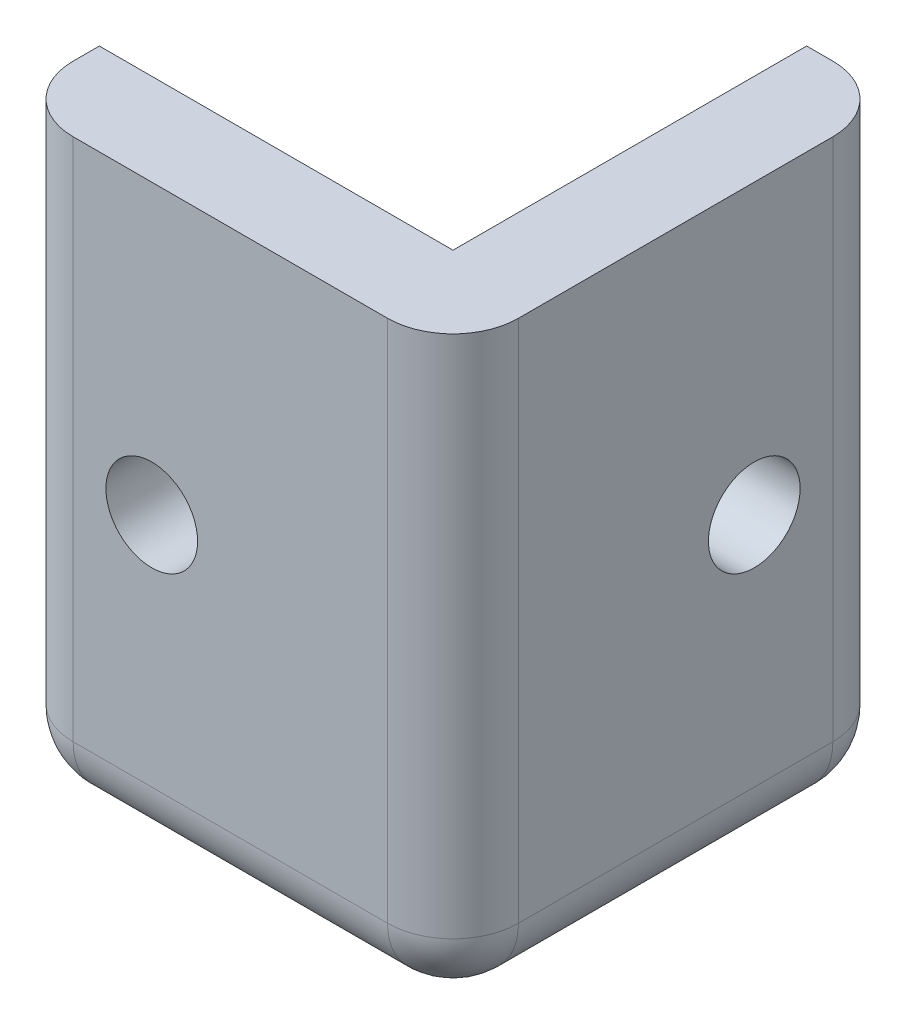
ISO-10303-21;
HEADER;
FILE_DESCRIPTION(('STEP AP214'),'2;1');
FILE_NAME('part.step','',(''),(''),'','','');
FILE_SCHEMA(('AUTOMOTIVE_DESIGN { 1 0 10303 214 1 1 1 1 }'));
ENDSEC;
DATA;
#1=APPLICATION_CONTEXT('core data for automotive mechanical design processes');
#2=APPLICATION_PROTOCOL_DEFINITION('international standard','automotive_design',2000,#1);
#3=PRODUCT_CONTEXT('',#1,'mechanical');
#4=PRODUCT('Part','Part','',(#3));
#5=PRODUCT_RELATED_PRODUCT_CATEGORY('part','',(#4));
#6=PRODUCT_DEFINITION_FORMATION('','',#4);
#7=PRODUCT_DEFINITION_CONTEXT('part definition',#1,'design');
#8=PRODUCT_DEFINITION('design','',#6,#7);
#9=PRODUCT_DEFINITION_SHAPE('','',#8);
#10=(LENGTH_UNIT() NAMED_UNIT(*) SI_UNIT(.MILLI.,.METRE.));
#11=(NAMED_UNIT(*) PLANE_ANGLE_UNIT() SI_UNIT($,.RADIAN.));
#12=(NAMED_UNIT(*) SI_UNIT($,.STERADIAN.) SOLID_ANGLE_UNIT());
#13=UNCERTAINTY_MEASURE_WITH_UNIT(LENGTH_MEASURE(1.E-05),#10,'distance_accuracy_value','');
#14=(GEOMETRIC_REPRESENTATION_CONTEXT(3) GLOBAL_UNCERTAINTY_ASSIGNED_CONTEXT((#13)) GLOBAL_UNIT_ASSIGNED_CONTEXT((#10,
#11,#12)) REPRESENTATION_CONTEXT('',''));
#15=CARTESIAN_POINT('',(0.,0.,0.));
#16=DIRECTION('',(0.,0.,1.));
#17=DIRECTION('',(1.,0.,0.));
#18=AXIS2_PLACEMENT_3D('',#15,#16,#17);
#19=CARTESIAN_POINT('',(0.,28.,0.));
#20=DIRECTION('',(1.,0.,0.));
#21=DIRECTION('',(0.,0.,-1.));
#22=AXIS2_PLACEMENT_3D('',#19,#20,#21);
#23=PLANE('',#22);
#24=DIRECTION('',(0.,1.,0.));
#25=VECTOR('',#24,1.);
#26=CARTESIAN_POINT('',(0.,-7.,-27.));
#27=LINE('',#26,#25);
#28=CARTESIAN_POINT('',(0.,-2.,-27.));
#29=VERTEX_POINT('',#28);
#30=CARTESIAN_POINT('',(0.,0.,-27.));
#31=VERTEX_POINT('',#30);
#32=EDGE_CURVE('E204',#29,#31,#27,.T.);
#33=ORIENTED_EDGE('',*,*,#32,.F.);
#34=DIRECTION('',(0.,0.,-1.));
#35=VECTOR('',#34,1.);
#36=CARTESIAN_POINT('',(0.,-2.,0.));
#37=LINE('',#36,#35);
#38=CARTESIAN_POINT('',(0.,-2.,2.));
#39=VERTEX_POINT('',#38);
#40=EDGE_CURVE('E11',#29,#39,#37,.F.);
#41=ORIENTED_EDGE('',*,*,#40,.T.);
#42=DIRECTION('',(0.,-1.,0.));
#43=VECTOR('',#42,1.);
#44=CARTESIAN_POINT('',(0.,28.,2.));
#45=LINE('',#44,#43);
#46=CARTESIAN_POINT('',(0.,38.,2.));
#47=VERTEX_POINT('',#46);
#48=EDGE_CURVE('E235',#39,#47,#45,.F.);
#49=ORIENTED_EDGE('',*,*,#48,.T.);
#50=DIRECTION('',(0.,0.,1.));
#51=VECTOR('',#50,1.);
#52=CARTESIAN_POINT('',(0.,38.,0.));
#53=LINE('',#52,#51);
#54=CARTESIAN_POINT('',(0.,38.,0.));
#55=VERTEX_POINT('',#54);
#56=EDGE_CURVE('E170',#55,#47,#53,.T.);
#57=ORIENTED_EDGE('',*,*,#56,.F.);
#58=DIRECTION('',(0.,-1.,0.));
#59=VECTOR('',#58,1.);
#60=CARTESIAN_POINT('',(0.,28.,0.));
#61=LINE('',#60,#59);
#62=CARTESIAN_POINT('',(0.,0.,0.));
#63=VERTEX_POINT('',#62);
#64=EDGE_CURVE('E212',#55,#63,#61,.T.);
#65=ORIENTED_EDGE('',*,*,#64,.T.);
#66=DIRECTION('',(0.,0.,-1.));
#67=VECTOR('',#66,1.);
#68=CARTESIAN_POINT('',(0.,0.,7.));
#69=LINE('',#68,#67);
#70=EDGE_CURVE('E198',#63,#31,#69,.T.);
#71=ORIENTED_EDGE('',*,*,#70,.T.);
#72=EDGE_LOOP('',(#33,#41,#49,#57,#65,#71));
#73=FACE_BOUND('',#72,.T.);
#74=ADVANCED_FACE('F37',(#73),#23,.F.);
#75=CARTESIAN_POINT('',(0.,28.,7.));
#76=DIRECTION('',(0.,0.,-1.));
#77=DIRECTION('',(-1.,0.,0.));
#78=AXIS2_PLACEMENT_3D('',#75,#76,#77);
#79=PLANE('',#78);
#80=CARTESIAN_POINT('',(11.,16.,7.));
#81=DIRECTION('',(0.,0.,1.));
#82=DIRECTION('',(1.,0.,0.));
#83=AXIS2_PLACEMENT_3D('',#80,#81,#82);
#84=CIRCLE('',#83,3.5);
#85=CARTESIAN_POINT('',(14.5,16.,7.));
#86=VERTEX_POINT('',#85);
#87=EDGE_CURVE('E185',#86,#86,#84,.T.);
#88=ORIENTED_EDGE('',*,*,#87,.F.);
#89=EDGE_LOOP('',(#88));
#90=FACE_BOUND('',#89,.T.);
#91=DIRECTION('',(0.,-1.,0.));
#92=VECTOR('',#91,1.);
#93=CARTESIAN_POINT('',(29.,28.,7.));
#94=LINE('',#93,#92);
#95=CARTESIAN_POINT('',(29.,-2.,7.));
#96=VERTEX_POINT('',#95);
#97=CARTESIAN_POINT('',(29.,38.,7.));
#98=VERTEX_POINT('',#97);
#99=EDGE_CURVE('E225',#96,#98,#94,.F.);
#100=ORIENTED_EDGE('',*,*,#99,.T.);
#101=DIRECTION('',(1.,0.,0.));
#102=VECTOR('',#101,1.);
#103=CARTESIAN_POINT('',(5.,38.,7.));
#104=LINE('',#103,#102);
#105=CARTESIAN_POINT('',(5.,38.,7.));
#106=VERTEX_POINT('',#105);
#107=EDGE_CURVE('E157',#106,#98,#104,.T.);
#108=ORIENTED_EDGE('',*,*,#107,.F.);
#109=DIRECTION('',(0.,-1.,0.));
#110=VECTOR('',#109,1.);
#111=CARTESIAN_POINT('',(5.,28.,7.));
#112=LINE('',#111,#110);
#113=CARTESIAN_POINT('',(5.,-2.,7.));
#114=VERTEX_POINT('',#113);
#115=EDGE_CURVE('E141',#106,#114,#112,.T.);
#116=ORIENTED_EDGE('',*,*,#115,.T.);
#117=DIRECTION('',(-1.,0.,0.));
#118=VECTOR('',#117,1.);
#119=CARTESIAN_POINT('',(0.,-2.,7.));
#120=LINE('',#119,#118);
#121=EDGE_CURVE('E227',#114,#96,#120,.F.);
#122=ORIENTED_EDGE('',*,*,#121,.T.);
#123=EDGE_LOOP('',(#100,#108,#116,#122));
#124=FACE_BOUND('',#123,.T.);
#125=ADVANCED_FACE('F278',(#90,#124),#79,.F.);
#126=CARTESIAN_POINT('',(34.,28.,7.));
#127=DIRECTION('',(-1.,0.,0.));
#128=DIRECTION('',(0.,0.,1.));
#129=AXIS2_PLACEMENT_3D('',#126,#127,#128);
#130=PLANE('',#129);
#131=CARTESIAN_POINT('',(34.,16.,-16.));
#132=DIRECTION('',(1.,0.,0.));
#133=DIRECTION('',(0.,0.,-1.));
#134=AXIS2_PLACEMENT_3D('',#131,#132,#133);
#135=CIRCLE('',#134,3.5);
#136=CARTESIAN_POINT('',(34.,16.,-19.5));
#137=VERTEX_POINT('',#136);
#138=EDGE_CURVE('E195',#137,#137,#135,.T.);
#139=ORIENTED_EDGE('',*,*,#138,.F.);
#140=EDGE_LOOP('',(#139));
#141=FACE_BOUND('',#140,.T.);
#142=DIRECTION('',(0.,0.,1.));
#143=VECTOR('',#142,1.);
#144=CARTESIAN_POINT('',(34.,-2.,7.));
#145=LINE('',#144,#143);
#146=CARTESIAN_POINT('',(34.,-2.,2.));
#147=VERTEX_POINT('',#146);
#148=CARTESIAN_POINT('',(34.,-2.,-22.));
#149=VERTEX_POINT('',#148);
#150=EDGE_CURVE('E140',#147,#149,#145,.F.);
#151=ORIENTED_EDGE('',*,*,#150,.T.);
#152=DIRECTION('',(0.,-1.,0.));
#153=VECTOR('',#152,1.);
#154=CARTESIAN_POINT('',(34.,28.,-22.));
#155=LINE('',#154,#153);
#156=CARTESIAN_POINT('',(34.,38.,-22.));
#157=VERTEX_POINT('',#156);
#158=EDGE_CURVE('E147',#149,#157,#155,.F.);
#159=ORIENTED_EDGE('',*,*,#158,.T.);
#160=DIRECTION('',(0.,0.,-1.));
#161=VECTOR('',#160,1.);
#162=CARTESIAN_POINT('',(34.,38.,2.));
#163=LINE('',#162,#161);
#164=CARTESIAN_POINT('',(34.,38.,2.));
#165=VERTEX_POINT('',#164);
#166=EDGE_CURVE('E144',#165,#157,#163,.T.);
#167=ORIENTED_EDGE('',*,*,#166,.F.);
#168=DIRECTION('',(0.,-1.,0.));
#169=VECTOR('',#168,1.);
#170=CARTESIAN_POINT('',(34.,28.,2.));
#171=LINE('',#170,#169);
#172=EDGE_CURVE('E128',#165,#147,#171,.T.);
#173=ORIENTED_EDGE('',*,*,#172,.T.);
#174=EDGE_LOOP('',(#151,#159,#167,#173));
#175=FACE_BOUND('',#174,.T.);
#176=ADVANCED_FACE('F145',(#141,#175),#130,.F.);
#177=CARTESIAN_POINT('',(27.,28.,-27.));
#178=DIRECTION('',(0.,0.,1.));
#179=DIRECTION('',(1.,0.,0.));
#180=AXIS2_PLACEMENT_3D('',#177,#178,#179);
#181=PLANE('',#180);
#182=DIRECTION('',(0.,-1.,0.));
#183=VECTOR('',#182,1.);
#184=CARTESIAN_POINT('',(29.,28.,-27.));
#185=LINE('',#184,#183);
#186=CARTESIAN_POINT('',(29.,38.,-27.));
#187=VERTEX_POINT('',#186);
#188=CARTESIAN_POINT('',(29.,-2.,-27.));
#189=VERTEX_POINT('',#188);
#190=EDGE_CURVE('E233',#187,#189,#185,.T.);
#191=ORIENTED_EDGE('',*,*,#190,.T.);
#192=DIRECTION('',(1.,0.,0.));
#193=VECTOR('',#192,1.);
#194=CARTESIAN_POINT('',(27.,-2.,-27.));
#195=LINE('',#194,#193);
#196=EDGE_CURVE('E46',#189,#29,#195,.F.);
#197=ORIENTED_EDGE('',*,*,#196,.T.);
#198=ORIENTED_EDGE('',*,*,#32,.T.);
#199=DIRECTION('',(1.,0.,0.));
#200=VECTOR('',#199,1.);
#201=CARTESIAN_POINT('',(34.,0.,-27.));
#202=LINE('',#201,#200);
#203=CARTESIAN_POINT('',(27.,0.,-27.));
#204=VERTEX_POINT('',#203);
#205=EDGE_CURVE('E201',#31,#204,#202,.T.);
#206=ORIENTED_EDGE('',*,*,#205,.T.);
#207=DIRECTION('',(0.,-1.,0.));
#208=VECTOR('',#207,1.);
#209=CARTESIAN_POINT('',(27.,28.,-27.));
#210=LINE('',#209,#208);
#211=CARTESIAN_POINT('',(27.,38.,-27.));
#212=VERTEX_POINT('',#211);
#213=EDGE_CURVE('E218',#212,#204,#210,.T.);
#214=ORIENTED_EDGE('',*,*,#213,.F.);
#215=DIRECTION('',(-1.,0.,0.));
#216=VECTOR('',#215,1.);
#217=CARTESIAN_POINT('',(29.,38.,-27.));
#218=LINE('',#217,#216);
#219=EDGE_CURVE('E161',#187,#212,#218,.T.);
#220=ORIENTED_EDGE('',*,*,#219,.F.);
#221=EDGE_LOOP('',(#191,#197,#198,#206,#214,#220));
#222=FACE_BOUND('',#221,.T.);
#223=ADVANCED_FACE('F295',(#222),#181,.F.);
#224=CARTESIAN_POINT('',(27.,28.,0.));
#225=DIRECTION('',(1.,0.,0.));
#226=DIRECTION('',(0.,0.,-1.));
#227=AXIS2_PLACEMENT_3D('',#224,#225,#226);
#228=PLANE('',#227);
#229=CARTESIAN_POINT('',(27.,16.,-16.));
#230=DIRECTION('',(1.,0.,0.));
#231=DIRECTION('',(0.,0.,-1.));
#232=AXIS2_PLACEMENT_3D('',#229,#230,#231);
#233=CIRCLE('',#232,2.);
#234=CARTESIAN_POINT('',(27.,16.,-18.));
#235=VERTEX_POINT('',#234);
#236=EDGE_CURVE('E190',#235,#235,#233,.T.);
#237=ORIENTED_EDGE('',*,*,#236,.T.);
#238=EDGE_LOOP('',(#237));
#239=FACE_BOUND('',#238,.T.);
#240=DIRECTION('',(0.,0.,1.));
#241=VECTOR('',#240,1.);
#242=CARTESIAN_POINT('',(27.,0.,0.));
#243=LINE('',#242,#241);
#244=CARTESIAN_POINT('',(27.,0.,0.));
#245=VERTEX_POINT('',#244);
#246=EDGE_CURVE('E206',#204,#245,#243,.T.);
#247=ORIENTED_EDGE('',*,*,#246,.T.);
#248=DIRECTION('',(0.,-1.,0.));
#249=VECTOR('',#248,1.);
#250=CARTESIAN_POINT('',(27.,28.,0.));
#251=LINE('',#250,#249);
#252=CARTESIAN_POINT('',(27.,38.,0.));
#253=VERTEX_POINT('',#252);
#254=EDGE_CURVE('E215',#253,#245,#251,.T.);
#255=ORIENTED_EDGE('',*,*,#254,.F.);
#256=DIRECTION('',(0.,0.,1.));
#257=VECTOR('',#256,1.);
#258=CARTESIAN_POINT('',(27.,38.,-27.));
#259=LINE('',#258,#257);
#260=EDGE_CURVE('E164',#212,#253,#259,.T.);
#261=ORIENTED_EDGE('',*,*,#260,.F.);
#262=ORIENTED_EDGE('',*,*,#213,.T.);
#263=EDGE_LOOP('',(#247,#255,#261,#262));
#264=FACE_BOUND('',#263,.T.);
#265=ADVANCED_FACE('F298',(#239,#264),#228,.F.);
#266=CARTESIAN_POINT('',(0.,28.,0.));
#267=DIRECTION('',(0.,0.,1.));
#268=DIRECTION('',(1.,0.,0.));
#269=AXIS2_PLACEMENT_3D('',#266,#267,#268);
#270=PLANE('',#269);
#271=CARTESIAN_POINT('',(11.,16.,0.));
#272=DIRECTION('',(0.,0.,1.));
#273=DIRECTION('',(1.,0.,0.));
#274=AXIS2_PLACEMENT_3D('',#271,#272,#273);
#275=CIRCLE('',#274,2.);
#276=CARTESIAN_POINT('',(13.,16.,0.));
#277=VERTEX_POINT('',#276);
#278=EDGE_CURVE('E180',#277,#277,#275,.T.);
#279=ORIENTED_EDGE('',*,*,#278,.T.);
#280=EDGE_LOOP('',(#279));
#281=FACE_BOUND('',#280,.T.);
#282=DIRECTION('',(-1.,0.,0.));
#283=VECTOR('',#282,1.);
#284=CARTESIAN_POINT('',(0.,0.,0.));
#285=LINE('',#284,#283);
#286=EDGE_CURVE('E209',#245,#63,#285,.T.);
#287=ORIENTED_EDGE('',*,*,#286,.T.);
#288=ORIENTED_EDGE('',*,*,#64,.F.);
#289=DIRECTION('',(-1.,0.,0.));
#290=VECTOR('',#289,1.);
#291=CARTESIAN_POINT('',(27.,38.,0.));
#292=LINE('',#291,#290);
#293=EDGE_CURVE('E167',#253,#55,#292,.T.);
#294=ORIENTED_EDGE('',*,*,#293,.F.);
#295=ORIENTED_EDGE('',*,*,#254,.T.);
#296=EDGE_LOOP('',(#287,#288,#294,#295));
#297=FACE_BOUND('',#296,.T.);
#298=ADVANCED_FACE('F302',(#281,#297),#270,.F.);
#299=CARTESIAN_POINT('',(0.,0.,0.));
#300=DIRECTION('',(0.,1.,0.));
#301=DIRECTION('',(0.,0.,1.));
#302=AXIS2_PLACEMENT_3D('',#299,#300,#301);
#303=PLANE('',#302);
#304=ORIENTED_EDGE('',*,*,#286,.F.);
#305=ORIENTED_EDGE('',*,*,#246,.F.);
#306=ORIENTED_EDGE('',*,*,#205,.F.);
#307=ORIENTED_EDGE('',*,*,#70,.F.);
#308=EDGE_LOOP('',(#304,#305,#306,#307));
#309=FACE_BOUND('',#308,.T.);
#310=ADVANCED_FACE('F305',(#309),#303,.T.);
#311=CARTESIAN_POINT('',(0.,-7.,0.));
#312=DIRECTION('',(0.,1.,0.));
#313=DIRECTION('',(0.,0.,1.));
#314=AXIS2_PLACEMENT_3D('',#311,#312,#313);
#315=PLANE('',#314);
#316=DIRECTION('',(0.,0.,-1.));
#317=VECTOR('',#316,1.);
#318=CARTESIAN_POINT('',(5.,-7.,0.));
#319=LINE('',#318,#317);
#320=CARTESIAN_POINT('',(5.,-7.,2.));
#321=VERTEX_POINT('',#320);
#322=CARTESIAN_POINT('',(5.,-7.,-22.));
#323=VERTEX_POINT('',#322);
#324=EDGE_CURVE('E61',#321,#323,#319,.T.);
#325=ORIENTED_EDGE('',*,*,#324,.T.);
#326=DIRECTION('',(1.,0.,0.));
#327=VECTOR('',#326,1.);
#328=CARTESIAN_POINT('',(0.,-7.,-22.));
#329=LINE('',#328,#327);
#330=CARTESIAN_POINT('',(29.,-7.,-22.));
#331=VERTEX_POINT('',#330);
#332=EDGE_CURVE('E256',#323,#331,#329,.T.);
#333=ORIENTED_EDGE('',*,*,#332,.T.);
#334=DIRECTION('',(0.,0.,1.));
#335=VECTOR('',#334,1.);
#336=CARTESIAN_POINT('',(29.,-7.,0.));
#337=LINE('',#336,#335);
#338=CARTESIAN_POINT('',(29.,-7.,2.));
#339=VERTEX_POINT('',#338);
#340=EDGE_CURVE('E221',#331,#339,#337,.T.);
#341=ORIENTED_EDGE('',*,*,#340,.T.);
#342=DIRECTION('',(-1.,0.,0.));
#343=VECTOR('',#342,1.);
#344=CARTESIAN_POINT('',(0.,-7.,2.));
#345=LINE('',#344,#343);
#346=EDGE_CURVE('E223',#339,#321,#345,.T.);
#347=ORIENTED_EDGE('',*,*,#346,.T.);
#348=EDGE_LOOP('',(#325,#333,#341,#347));
#349=FACE_BOUND('',#348,.T.);
#350=ADVANCED_FACE('F307',(#349),#315,.F.);
#351=CARTESIAN_POINT('',(29.,28.,-22.));
#352=DIRECTION('',(0.,-1.,0.));
#353=DIRECTION('',(0.,0.,-1.));
#354=AXIS2_PLACEMENT_3D('',#351,#352,#353);
#355=CYLINDRICAL_SURFACE('',#354,5.);
#356=ORIENTED_EDGE('',*,*,#158,.F.);
#357=CARTESIAN_POINT('',(29.,-2.,-22.));
#358=DIRECTION('',(0.,-1.,0.));
#359=DIRECTION('',(0.,0.,-1.));
#360=AXIS2_PLACEMENT_3D('',#357,#358,#359);
#361=CIRCLE('',#360,5.);
#362=EDGE_CURVE('E249',#149,#189,#361,.F.);
#363=ORIENTED_EDGE('',*,*,#362,.T.);
#364=ORIENTED_EDGE('',*,*,#190,.F.);
#365=CARTESIAN_POINT('',(29.,38.,-22.));
#366=DIRECTION('',(0.,1.,0.));
#367=DIRECTION('',(0.,0.,1.));
#368=AXIS2_PLACEMENT_3D('',#365,#366,#367);
#369=CIRCLE('',#368,5.);
#370=EDGE_CURVE('E151',#157,#187,#369,.T.);
#371=ORIENTED_EDGE('',*,*,#370,.F.);
#372=EDGE_LOOP('',(#356,#363,#364,#371));
#373=FACE_BOUND('',#372,.T.);
#374=ADVANCED_FACE('F292',(#373),#355,.T.);
#375=CARTESIAN_POINT('',(29.,28.,2.));
#376=DIRECTION('',(0.,-1.,0.));
#377=DIRECTION('',(0.,0.,-1.));
#378=AXIS2_PLACEMENT_3D('',#375,#376,#377);
#379=CYLINDRICAL_SURFACE('',#378,5.);
#380=ORIENTED_EDGE('',*,*,#172,.F.);
#381=CARTESIAN_POINT('',(29.,38.,2.));
#382=DIRECTION('',(0.,1.,0.));
#383=DIRECTION('',(0.,0.,1.));
#384=AXIS2_PLACEMENT_3D('',#381,#382,#383);
#385=CIRCLE('',#384,5.);
#386=EDGE_CURVE('E133',#98,#165,#385,.T.);
#387=ORIENTED_EDGE('',*,*,#386,.F.);
#388=ORIENTED_EDGE('',*,*,#99,.F.);
#389=CARTESIAN_POINT('',(29.,-2.,2.));
#390=DIRECTION('',(0.,-1.,0.));
#391=DIRECTION('',(0.,0.,-1.));
#392=AXIS2_PLACEMENT_3D('',#389,#390,#391);
#393=CIRCLE('',#392,5.);
#394=EDGE_CURVE('E135',#147,#96,#393,.T.);
#395=ORIENTED_EDGE('',*,*,#394,.F.);
#396=EDGE_LOOP('',(#380,#387,#388,#395));
#397=FACE_BOUND('',#396,.T.);
#398=ADVANCED_FACE('F130',(#397),#379,.T.);
#399=CARTESIAN_POINT('',(29.,-2.,0.));
#400=DIRECTION('',(0.,0.,1.));
#401=DIRECTION('',(1.,0.,0.));
#402=AXIS2_PLACEMENT_3D('',#399,#400,#401);
#403=CYLINDRICAL_SURFACE('',#402,5.);
#404=ORIENTED_EDGE('',*,*,#340,.F.);
#405=CARTESIAN_POINT('',(29.,-2.,-22.));
#406=DIRECTION('',(0.,0.,1.));
#407=DIRECTION('',(1.,0.,0.));
#408=AXIS2_PLACEMENT_3D('',#405,#406,#407);
#409=CIRCLE('',#408,5.);
#410=EDGE_CURVE('E237',#331,#149,#409,.T.);
#411=ORIENTED_EDGE('',*,*,#410,.T.);
#412=ORIENTED_EDGE('',*,*,#150,.F.);
#413=CARTESIAN_POINT('',(29.,-2.,2.));
#414=DIRECTION('',(0.,0.,1.));
#415=DIRECTION('',(1.,0.,0.));
#416=AXIS2_PLACEMENT_3D('',#413,#414,#415);
#417=CIRCLE('',#416,5.);
#418=EDGE_CURVE('E240',#339,#147,#417,.T.);
#419=ORIENTED_EDGE('',*,*,#418,.F.);
#420=EDGE_LOOP('',(#404,#411,#412,#419));
#421=FACE_BOUND('',#420,.T.);
#422=ADVANCED_FACE('F288',(#421),#403,.T.);
#423=CARTESIAN_POINT('',(29.,-2.,2.));
#424=DIRECTION('',(0.,0.,1.));
#425=DIRECTION('',(1.,0.,0.));
#426=AXIS2_PLACEMENT_3D('',#423,#424,#425);
#427=SPHERICAL_SURFACE('',#426,5.);
#428=ORIENTED_EDGE('',*,*,#418,.T.);
#429=ORIENTED_EDGE('',*,*,#394,.T.);
#430=CARTESIAN_POINT('',(29.,-2.,2.));
#431=DIRECTION('',(1.,0.,0.));
#432=DIRECTION('',(0.,0.,-1.));
#433=AXIS2_PLACEMENT_3D('',#430,#431,#432);
#434=CIRCLE('',#433,5.);
#435=EDGE_CURVE('E194',#339,#96,#434,.F.);
#436=ORIENTED_EDGE('',*,*,#435,.F.);
#437=EDGE_LOOP('',(#428,#429,#436));
#438=FACE_BOUND('',#437,.T.);
#439=ADVANCED_FACE('F284',(#438),#427,.T.);
#440=CARTESIAN_POINT('',(5.,28.,2.));
#441=DIRECTION('',(0.,-1.,0.));
#442=DIRECTION('',(0.,0.,-1.));
#443=AXIS2_PLACEMENT_3D('',#440,#441,#442);
#444=CYLINDRICAL_SURFACE('',#443,5.);
#445=ORIENTED_EDGE('',*,*,#48,.F.);
#446=CARTESIAN_POINT('',(5.,-2.,2.));
#447=DIRECTION('',(0.,-1.,0.));
#448=DIRECTION('',(0.,0.,-1.));
#449=AXIS2_PLACEMENT_3D('',#446,#447,#448);
#450=CIRCLE('',#449,5.);
#451=EDGE_CURVE('E253',#39,#114,#450,.F.);
#452=ORIENTED_EDGE('',*,*,#451,.T.);
#453=ORIENTED_EDGE('',*,*,#115,.F.);
#454=CARTESIAN_POINT('',(5.,38.,2.));
#455=DIRECTION('',(0.,1.,0.));
#456=DIRECTION('',(0.,0.,1.));
#457=AXIS2_PLACEMENT_3D('',#454,#455,#456);
#458=CIRCLE('',#457,5.);
#459=EDGE_CURVE('E173',#47,#106,#458,.T.);
#460=ORIENTED_EDGE('',*,*,#459,.F.);
#461=EDGE_LOOP('',(#445,#452,#453,#460));
#462=FACE_BOUND('',#461,.T.);
#463=ADVANCED_FACE('F274',(#462),#444,.T.);
#464=CARTESIAN_POINT('',(0.,-2.,2.));
#465=DIRECTION('',(-1.,0.,0.));
#466=DIRECTION('',(0.,0.,1.));
#467=AXIS2_PLACEMENT_3D('',#464,#465,#466);
#468=CYLINDRICAL_SURFACE('',#467,5.);
#469=ORIENTED_EDGE('',*,*,#121,.F.);
#470=CARTESIAN_POINT('',(5.,-2.,2.));
#471=DIRECTION('',(-1.,0.,0.));
#472=DIRECTION('',(0.,0.,1.));
#473=AXIS2_PLACEMENT_3D('',#470,#471,#472);
#474=CIRCLE('',#473,5.);
#475=EDGE_CURVE('E251',#114,#321,#474,.F.);
#476=ORIENTED_EDGE('',*,*,#475,.T.);
#477=ORIENTED_EDGE('',*,*,#346,.F.);
#478=ORIENTED_EDGE('',*,*,#435,.T.);
#479=EDGE_LOOP('',(#469,#476,#477,#478));
#480=FACE_BOUND('',#479,.T.);
#481=ADVANCED_FACE('F280',(#480),#468,.T.);
#482=CARTESIAN_POINT('',(29.,16.,-16.));
#483=DIRECTION('',(1.,0.,0.));
#484=DIRECTION('',(0.,0.,-1.));
#485=AXIS2_PLACEMENT_3D('',#482,#483,#484);
#486=CYLINDRICAL_SURFACE('',#485,3.5);
#487=CARTESIAN_POINT('',(29.,16.,-16.));
#488=DIRECTION('',(1.,0.,0.));
#489=DIRECTION('',(0.,0.,-1.));
#490=AXIS2_PLACEMENT_3D('',#487,#488,#489);
#491=CIRCLE('',#490,3.5);
#492=CARTESIAN_POINT('',(29.,16.,-19.5));
#493=VERTEX_POINT('',#492);
#494=EDGE_CURVE('E191',#493,#493,#491,.T.);
#495=ORIENTED_EDGE('',*,*,#494,.F.);
#496=EDGE_LOOP('',(#495));
#497=FACE_BOUND('',#496,.T.);
#498=ORIENTED_EDGE('',*,*,#138,.T.);
#499=EDGE_LOOP('',(#498));
#500=FACE_BOUND('',#499,.T.);
#501=ADVANCED_FACE('F328',(#497,#500),#486,.F.);
#502=CARTESIAN_POINT('',(29.,16.,-16.));
#503=DIRECTION('',(1.,0.,0.));
#504=DIRECTION('',(0.,0.,-1.));
#505=AXIS2_PLACEMENT_3D('',#502,#503,#504);
#506=PLANE('',#505);
#507=CARTESIAN_POINT('',(29.,16.,-16.));
#508=DIRECTION('',(1.,0.,0.));
#509=DIRECTION('',(0.,0.,-1.));
#510=AXIS2_PLACEMENT_3D('',#507,#508,#509);
#511=CIRCLE('',#510,2.);
#512=CARTESIAN_POINT('',(29.,16.,-18.));
#513=VERTEX_POINT('',#512);
#514=EDGE_CURVE('E184',#513,#513,#511,.T.);
#515=ORIENTED_EDGE('',*,*,#514,.F.);
#516=EDGE_LOOP('',(#515));
#517=FACE_BOUND('',#516,.T.);
#518=ORIENTED_EDGE('',*,*,#494,.T.);
#519=EDGE_LOOP('',(#518));
#520=FACE_BOUND('',#519,.T.);
#521=ADVANCED_FACE('F370',(#517,#520),#506,.T.);
#522=CARTESIAN_POINT('',(24.,16.,-16.));
#523=DIRECTION('',(1.,0.,0.));
#524=DIRECTION('',(0.,0.,-1.));
#525=AXIS2_PLACEMENT_3D('',#522,#523,#524);
#526=CYLINDRICAL_SURFACE('',#525,2.);
#527=ORIENTED_EDGE('',*,*,#514,.T.);
#528=EDGE_LOOP('',(#527));
#529=FACE_BOUND('',#528,.T.);
#530=ORIENTED_EDGE('',*,*,#236,.F.);
#531=EDGE_LOOP('',(#530));
#532=FACE_BOUND('',#531,.T.);
#533=ADVANCED_FACE('F366',(#529,#532),#526,.F.);
#534=CARTESIAN_POINT('',(11.,16.,2.));
#535=DIRECTION('',(0.,0.,1.));
#536=DIRECTION('',(1.,0.,0.));
#537=AXIS2_PLACEMENT_3D('',#534,#535,#536);
#538=CYLINDRICAL_SURFACE('',#537,3.5);
#539=CARTESIAN_POINT('',(11.,16.,2.));
#540=DIRECTION('',(0.,0.,1.));
#541=DIRECTION('',(1.,0.,0.));
#542=AXIS2_PLACEMENT_3D('',#539,#540,#541);
#543=CIRCLE('',#542,3.5);
#544=CARTESIAN_POINT('',(14.5,16.,2.));
#545=VERTEX_POINT('',#544);
#546=EDGE_CURVE('E181',#545,#545,#543,.T.);
#547=ORIENTED_EDGE('',*,*,#546,.F.);
#548=EDGE_LOOP('',(#547));
#549=FACE_BOUND('',#548,.T.);
#550=ORIENTED_EDGE('',*,*,#87,.T.);
#551=EDGE_LOOP('',(#550));
#552=FACE_BOUND('',#551,.T.);
#553=ADVANCED_FACE('F358',(#549,#552),#538,.F.);
#554=CARTESIAN_POINT('',(11.,16.,2.));
#555=DIRECTION('',(0.,0.,1.));
#556=DIRECTION('',(1.,0.,0.));
#557=AXIS2_PLACEMENT_3D('',#554,#555,#556);
#558=PLANE('',#557);
#559=CARTESIAN_POINT('',(11.,16.,2.));
#560=DIRECTION('',(0.,0.,1.));
#561=DIRECTION('',(1.,0.,0.));
#562=AXIS2_PLACEMENT_3D('',#559,#560,#561);
#563=CIRCLE('',#562,2.);
#564=CARTESIAN_POINT('',(13.,16.,2.));
#565=VERTEX_POINT('',#564);
#566=EDGE_CURVE('E177',#565,#565,#563,.T.);
#567=ORIENTED_EDGE('',*,*,#566,.F.);
#568=EDGE_LOOP('',(#567));
#569=FACE_BOUND('',#568,.T.);
#570=ORIENTED_EDGE('',*,*,#546,.T.);
#571=EDGE_LOOP('',(#570));
#572=FACE_BOUND('',#571,.T.);
#573=ADVANCED_FACE('F352',(#569,#572),#558,.T.);
#574=CARTESIAN_POINT('',(11.,16.,-3.));
#575=DIRECTION('',(0.,0.,1.));
#576=DIRECTION('',(1.,0.,0.));
#577=AXIS2_PLACEMENT_3D('',#574,#575,#576);
#578=CYLINDRICAL_SURFACE('',#577,2.);
#579=ORIENTED_EDGE('',*,*,#566,.T.);
#580=EDGE_LOOP('',(#579));
#581=FACE_BOUND('',#580,.T.);
#582=ORIENTED_EDGE('',*,*,#278,.F.);
#583=EDGE_LOOP('',(#582));
#584=FACE_BOUND('',#583,.T.);
#585=ADVANCED_FACE('F348',(#581,#584),#578,.F.);
#586=CARTESIAN_POINT('',(5.,-2.,2.));
#587=DIRECTION('',(0.,0.,1.));
#588=DIRECTION('',(1.,0.,0.));
#589=AXIS2_PLACEMENT_3D('',#586,#587,#588);
#590=SPHERICAL_SURFACE('',#589,5.);
#591=ORIENTED_EDGE('',*,*,#475,.F.);
#592=ORIENTED_EDGE('',*,*,#451,.F.);
#593=CARTESIAN_POINT('',(5.,-2.,2.));
#594=DIRECTION('',(0.,0.,-1.));
#595=DIRECTION('',(-1.,0.,0.));
#596=AXIS2_PLACEMENT_3D('',#593,#594,#595);
#597=CIRCLE('',#596,5.);
#598=EDGE_CURVE('E41',#321,#39,#597,.T.);
#599=ORIENTED_EDGE('',*,*,#598,.F.);
#600=EDGE_LOOP('',(#591,#592,#599));
#601=FACE_BOUND('',#600,.T.);
#602=ADVANCED_FACE('F39',(#601),#590,.T.);
#603=CARTESIAN_POINT('',(5.,-2.,0.));
#604=DIRECTION('',(0.,0.,-1.));
#605=DIRECTION('',(-1.,0.,0.));
#606=AXIS2_PLACEMENT_3D('',#603,#604,#605);
#607=CYLINDRICAL_SURFACE('',#606,5.);
#608=ORIENTED_EDGE('',*,*,#598,.T.);
#609=ORIENTED_EDGE('',*,*,#40,.F.);
#610=CARTESIAN_POINT('',(5.,-2.,-22.));
#611=DIRECTION('',(0.707106781186547,0.,-0.707106781186547));
#612=DIRECTION('',(-0.707106781186547,0.,-0.707106781186547));
#613=AXIS2_PLACEMENT_3D('',#610,#611,#612);
#614=ELLIPSE('',#613,7.07106781186547,5.);
#615=EDGE_CURVE('E260',#323,#29,#614,.T.);
#616=ORIENTED_EDGE('',*,*,#615,.F.);
#617=ORIENTED_EDGE('',*,*,#324,.F.);
#618=EDGE_LOOP('',(#608,#609,#616,#617));
#619=FACE_BOUND('',#618,.T.);
#620=ADVANCED_FACE('F268',(#619),#607,.T.);
#621=CARTESIAN_POINT('',(0.,-2.,-22.));
#622=DIRECTION('',(1.,0.,0.));
#623=DIRECTION('',(0.,0.,-1.));
#624=AXIS2_PLACEMENT_3D('',#621,#622,#623);
#625=CYLINDRICAL_SURFACE('',#624,5.);
#626=ORIENTED_EDGE('',*,*,#615,.T.);
#627=ORIENTED_EDGE('',*,*,#196,.F.);
#628=CARTESIAN_POINT('',(29.,-2.,-22.));
#629=DIRECTION('',(1.,0.,0.));
#630=DIRECTION('',(0.,0.,-1.));
#631=AXIS2_PLACEMENT_3D('',#628,#629,#630);
#632=CIRCLE('',#631,5.);
#633=EDGE_CURVE('E176',#331,#189,#632,.T.);
#634=ORIENTED_EDGE('',*,*,#633,.F.);
#635=ORIENTED_EDGE('',*,*,#332,.F.);
#636=EDGE_LOOP('',(#626,#627,#634,#635));
#637=FACE_BOUND('',#636,.T.);
#638=ADVANCED_FACE('F341',(#637),#625,.T.);
#639=CARTESIAN_POINT('',(29.,-2.,-22.));
#640=DIRECTION('',(0.,0.,1.));
#641=DIRECTION('',(1.,0.,0.));
#642=AXIS2_PLACEMENT_3D('',#639,#640,#641);
#643=SPHERICAL_SURFACE('',#642,5.);
#644=ORIENTED_EDGE('',*,*,#633,.T.);
#645=ORIENTED_EDGE('',*,*,#362,.F.);
#646=ORIENTED_EDGE('',*,*,#410,.F.);
#647=EDGE_LOOP('',(#644,#645,#646));
#648=FACE_BOUND('',#647,.T.);
#649=ADVANCED_FACE('F339',(#648),#643,.T.);
#650=CARTESIAN_POINT('',(29.,38.,2.));
#651=DIRECTION('',(0.,1.,0.));
#652=DIRECTION('',(0.,0.,1.));
#653=AXIS2_PLACEMENT_3D('',#650,#651,#652);
#654=PLANE('',#653);
#655=ORIENTED_EDGE('',*,*,#386,.T.);
#656=ORIENTED_EDGE('',*,*,#166,.T.);
#657=ORIENTED_EDGE('',*,*,#370,.T.);
#658=ORIENTED_EDGE('',*,*,#219,.T.);
#659=ORIENTED_EDGE('',*,*,#260,.T.);
#660=ORIENTED_EDGE('',*,*,#293,.T.);
#661=ORIENTED_EDGE('',*,*,#56,.T.);
#662=ORIENTED_EDGE('',*,*,#459,.T.);
#663=ORIENTED_EDGE('',*,*,#107,.T.);
#664=EDGE_LOOP('',(#655,#656,#657,#658,#659,#660,#661,#662,#663));
#665=FACE_BOUND('',#664,.T.);
#666=ADVANCED_FACE('F154',(#665),#654,.T.);
#667=CLOSED_SHELL('',(#74,#125,#176,#223,#265,#298,#310,#350,#374,#398,#422,#439,#463,#481,#501,
#521,#533,#553,#573,#585,#602,#620,#638,#649,#666));
#668=MANIFOLD_SOLID_BREP('B2',#667);
#669=ADVANCED_BREP_SHAPE_REPRESENTATION('',(#18,#668),#14);
#670=SHAPE_DEFINITION_REPRESENTATION(#9,#669);
ENDSEC;
END-ISO-10303-21;
